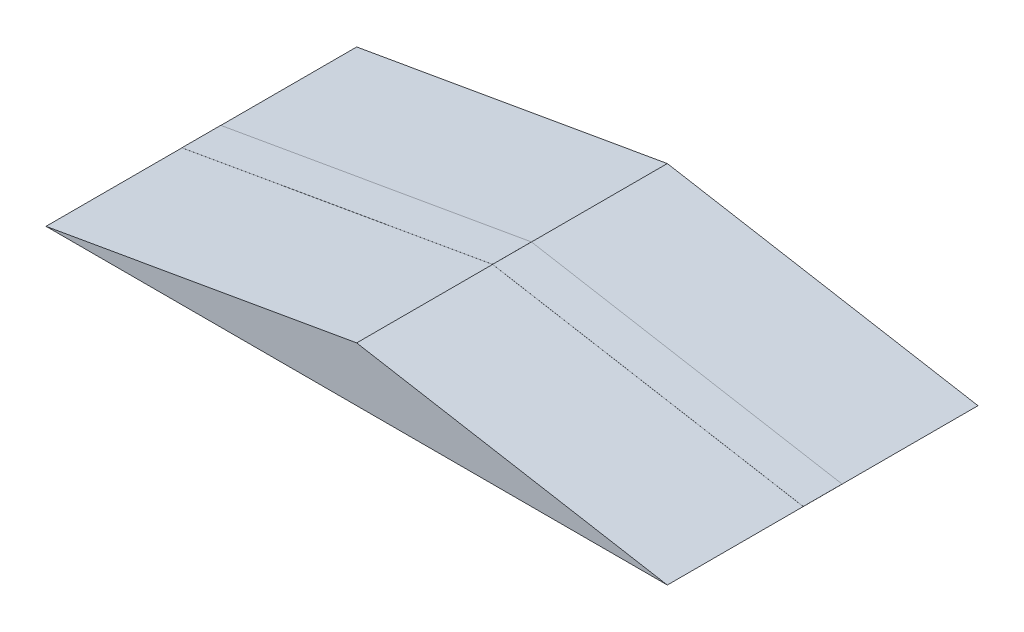
ISO-10303-21;
HEADER;
FILE_DESCRIPTION(('STEP AP214'),'2;1');
FILE_NAME('part.step','',(''),(''),'','','');
FILE_SCHEMA(('AUTOMOTIVE_DESIGN { 1 0 10303 214 1 1 1 1 }'));
ENDSEC;
DATA;
#1=APPLICATION_CONTEXT('core data for automotive mechanical design processes');
#2=APPLICATION_PROTOCOL_DEFINITION('international standard','automotive_design',2000,#1);
#3=PRODUCT_CONTEXT('',#1,'mechanical');
#4=PRODUCT('Part','Part','',(#3));
#5=PRODUCT_RELATED_PRODUCT_CATEGORY('part','',(#4));
#6=PRODUCT_DEFINITION_FORMATION('','',#4);
#7=PRODUCT_DEFINITION_CONTEXT('part definition',#1,'design');
#8=PRODUCT_DEFINITION('design','',#6,#7);
#9=PRODUCT_DEFINITION_SHAPE('','',#8);
#10=(LENGTH_UNIT() NAMED_UNIT(*) SI_UNIT(.MILLI.,.METRE.));
#11=(NAMED_UNIT(*) PLANE_ANGLE_UNIT() SI_UNIT($,.RADIAN.));
#12=(NAMED_UNIT(*) SI_UNIT($,.STERADIAN.) SOLID_ANGLE_UNIT());
#13=UNCERTAINTY_MEASURE_WITH_UNIT(LENGTH_MEASURE(1.E-05),#10,'distance_accuracy_value','');
#14=(GEOMETRIC_REPRESENTATION_CONTEXT(3) GLOBAL_UNCERTAINTY_ASSIGNED_CONTEXT((#13)) GLOBAL_UNIT_ASSIGNED_CONTEXT((#10,
#11,#12)) REPRESENTATION_CONTEXT('',''));
#15=CARTESIAN_POINT('',(0.,0.,0.));
#16=DIRECTION('',(0.,0.,1.));
#17=DIRECTION('',(1.,0.,0.));
#18=AXIS2_PLACEMENT_3D('',#15,#16,#17);
#19=CARTESIAN_POINT('',(-400.,0.,400.));
#20=DIRECTION('',(0.172380331752248,-0.985030467155704,0.));
#21=DIRECTION('',(0.985030467155704,0.172380331752248,0.));
#22=AXIS2_PLACEMENT_3D('',#19,#20,#21);
#23=PLANE('',#22);
#24=DIRECTION('',(0.,0.,-1.));
#25=VECTOR('',#24,1.);
#26=CARTESIAN_POINT('',(-400.,0.,400.));
#27=LINE('',#26,#25);
#28=CARTESIAN_POINT('',(-400.,0.,175.));
#29=VERTEX_POINT('',#28);
#30=CARTESIAN_POINT('',(-400.,0.,0.));
#31=VERTEX_POINT('',#30);
#32=EDGE_CURVE('E46',#29,#31,#27,.T.);
#33=ORIENTED_EDGE('',*,*,#32,.F.);
#34=DIRECTION('',(0.985030467155704,0.172380331752248,0.));
#35=VECTOR('',#34,1.);
#36=CARTESIAN_POINT('',(-400.,0.,175.));
#37=LINE('',#36,#35);
#38=CARTESIAN_POINT('',(0.,70.,175.));
#39=VERTEX_POINT('',#38);
#40=EDGE_CURVE('E148',#29,#39,#37,.T.);
#41=ORIENTED_EDGE('',*,*,#40,.T.);
#42=DIRECTION('',(0.,0.,-1.));
#43=VECTOR('',#42,1.);
#44=CARTESIAN_POINT('',(0.,70.,400.));
#45=LINE('',#44,#43);
#46=CARTESIAN_POINT('',(0.,70.,0.));
#47=VERTEX_POINT('',#46);
#48=EDGE_CURVE('E195',#39,#47,#45,.T.);
#49=ORIENTED_EDGE('',*,*,#48,.T.);
#50=DIRECTION('',(-0.985030467155704,-0.172380331752248,0.));
#51=VECTOR('',#50,1.);
#52=CARTESIAN_POINT('',(-400.,0.,0.));
#53=LINE('',#52,#51);
#54=EDGE_CURVE('E186',#47,#31,#53,.T.);
#55=ORIENTED_EDGE('',*,*,#54,.T.);
#56=EDGE_LOOP('',(#33,#41,#49,#55));
#57=FACE_BOUND('',#56,.T.);
#58=ADVANCED_FACE('F38',(#57),#23,.F.);
#59=CARTESIAN_POINT('',(400.,0.,400.));
#60=DIRECTION('',(-0.172380331752248,-0.985030467155704,0.));
#61=DIRECTION('',(0.985030467155704,-0.172380331752248,0.));
#62=AXIS2_PLACEMENT_3D('',#59,#60,#61);
#63=PLANE('',#62);
#64=DIRECTION('',(0.985030467155704,-0.172380331752248,0.));
#65=VECTOR('',#64,1.);
#66=CARTESIAN_POINT('',(400.,0.,225.));
#67=LINE('',#66,#65);
#68=CARTESIAN_POINT('',(0.,70.,225.));
#69=VERTEX_POINT('',#68);
#70=CARTESIAN_POINT('',(400.,0.,225.));
#71=VERTEX_POINT('',#70);
#72=EDGE_CURVE('E170',#69,#71,#67,.T.);
#73=ORIENTED_EDGE('',*,*,#72,.F.);
#74=CARTESIAN_POINT('',(0.,70.,400.));
#75=VERTEX_POINT('',#74);
#76=EDGE_CURVE('E203',#75,#69,#45,.T.);
#77=ORIENTED_EDGE('',*,*,#76,.F.);
#78=DIRECTION('',(-0.985030467155704,0.172380331752248,0.));
#79=VECTOR('',#78,1.);
#80=CARTESIAN_POINT('',(400.,0.,400.));
#81=LINE('',#80,#79);
#82=CARTESIAN_POINT('',(400.,0.,400.));
#83=VERTEX_POINT('',#82);
#84=EDGE_CURVE('E193',#83,#75,#81,.T.);
#85=ORIENTED_EDGE('',*,*,#84,.F.);
#86=DIRECTION('',(0.,0.,-1.));
#87=VECTOR('',#86,1.);
#88=CARTESIAN_POINT('',(400.,0.,400.));
#89=LINE('',#88,#87);
#90=EDGE_CURVE('E206',#83,#71,#89,.T.);
#91=ORIENTED_EDGE('',*,*,#90,.T.);
#92=EDGE_LOOP('',(#73,#77,#85,#91));
#93=FACE_BOUND('',#92,.T.);
#94=ADVANCED_FACE('F237',(#93),#63,.F.);
#95=DIRECTION('',(-0.985030467155704,0.172380331752248,0.));
#96=VECTOR('',#95,1.);
#97=CARTESIAN_POINT('',(400.,0.,175.));
#98=LINE('',#97,#96);
#99=CARTESIAN_POINT('',(400.,0.,175.));
#100=VERTEX_POINT('',#99);
#101=EDGE_CURVE('E53',#100,#39,#98,.T.);
#102=ORIENTED_EDGE('',*,*,#101,.F.);
#103=CARTESIAN_POINT('',(400.,0.,0.));
#104=VERTEX_POINT('',#103);
#105=EDGE_CURVE('E205',#100,#104,#89,.T.);
#106=ORIENTED_EDGE('',*,*,#105,.T.);
#107=DIRECTION('',(-0.985030467155704,0.172380331752248,0.));
#108=VECTOR('',#107,1.);
#109=CARTESIAN_POINT('',(400.,0.,0.));
#110=LINE('',#109,#108);
#111=EDGE_CURVE('E191',#104,#47,#110,.T.);
#112=ORIENTED_EDGE('',*,*,#111,.T.);
#113=ORIENTED_EDGE('',*,*,#48,.F.);
#114=EDGE_LOOP('',(#102,#106,#112,#113));
#115=FACE_BOUND('',#114,.T.);
#116=ADVANCED_FACE('F210',(#115),#63,.F.);
#117=ORIENTED_EDGE('',*,*,#76,.T.);
#118=DIRECTION('',(-0.985030467155704,-0.172380331752248,0.));
#119=VECTOR('',#118,1.);
#120=CARTESIAN_POINT('',(-400.,0.,225.));
#121=LINE('',#120,#119);
#122=CARTESIAN_POINT('',(-400.,0.,225.));
#123=VERTEX_POINT('',#122);
#124=EDGE_CURVE('E139',#69,#123,#121,.T.);
#125=ORIENTED_EDGE('',*,*,#124,.T.);
#126=CARTESIAN_POINT('',(-400.,0.,400.));
#127=VERTEX_POINT('',#126);
#128=EDGE_CURVE('E11',#127,#123,#27,.T.);
#129=ORIENTED_EDGE('',*,*,#128,.F.);
#130=DIRECTION('',(-0.985030467155704,-0.172380331752248,0.));
#131=VECTOR('',#130,1.);
#132=CARTESIAN_POINT('',(-400.,0.,400.));
#133=LINE('',#132,#131);
#134=EDGE_CURVE('E187',#75,#127,#133,.T.);
#135=ORIENTED_EDGE('',*,*,#134,.F.);
#136=EDGE_LOOP('',(#117,#125,#129,#135));
#137=FACE_BOUND('',#136,.T.);
#138=ADVANCED_FACE('F40',(#137),#23,.F.);
#139=CARTESIAN_POINT('',(-400.,0.,400.));
#140=DIRECTION('',(0.,1.,0.));
#141=DIRECTION('',(0.,0.,1.));
#142=AXIS2_PLACEMENT_3D('',#139,#140,#141);
#143=PLANE('',#142);
#144=DIRECTION('',(1.,0.,0.));
#145=VECTOR('',#144,1.);
#146=CARTESIAN_POINT('',(-400.,0.,0.));
#147=LINE('',#146,#145);
#148=EDGE_CURVE('E198',#31,#104,#147,.T.);
#149=ORIENTED_EDGE('',*,*,#148,.T.);
#150=ORIENTED_EDGE('',*,*,#105,.F.);
#151=DIRECTION('',(0.,0.,-1.));
#152=VECTOR('',#151,1.);
#153=CARTESIAN_POINT('',(400.,0.,225.));
#154=LINE('',#153,#152);
#155=EDGE_CURVE('E60',#71,#100,#154,.T.);
#156=ORIENTED_EDGE('',*,*,#155,.F.);
#157=ORIENTED_EDGE('',*,*,#90,.F.);
#158=DIRECTION('',(1.,0.,0.));
#159=VECTOR('',#158,1.);
#160=CARTESIAN_POINT('',(-400.,0.,400.));
#161=LINE('',#160,#159);
#162=EDGE_CURVE('E190',#127,#83,#161,.T.);
#163=ORIENTED_EDGE('',*,*,#162,.F.);
#164=ORIENTED_EDGE('',*,*,#128,.T.);
#165=DIRECTION('',(0.,0.,-1.));
#166=VECTOR('',#165,1.);
#167=CARTESIAN_POINT('',(-400.,0.,225.));
#168=LINE('',#167,#166);
#169=EDGE_CURVE('E150',#123,#29,#168,.T.);
#170=ORIENTED_EDGE('',*,*,#169,.T.);
#171=ORIENTED_EDGE('',*,*,#32,.T.);
#172=EDGE_LOOP('',(#149,#150,#156,#157,#163,#164,#170,#171));
#173=FACE_BOUND('',#172,.T.);
#174=ADVANCED_FACE('F214',(#173),#143,.F.);
#175=CARTESIAN_POINT('',(0.,0.,400.));
#176=DIRECTION('',(0.,0.,1.));
#177=DIRECTION('',(1.,0.,0.));
#178=AXIS2_PLACEMENT_3D('',#175,#176,#177);
#179=PLANE('',#178);
#180=ORIENTED_EDGE('',*,*,#134,.T.);
#181=ORIENTED_EDGE('',*,*,#162,.T.);
#182=ORIENTED_EDGE('',*,*,#84,.T.);
#183=EDGE_LOOP('',(#180,#181,#182));
#184=FACE_BOUND('',#183,.T.);
#185=ADVANCED_FACE('F242',(#184),#179,.T.);
#186=CARTESIAN_POINT('',(0.,0.,0.));
#187=DIRECTION('',(0.,0.,1.));
#188=DIRECTION('',(1.,0.,0.));
#189=AXIS2_PLACEMENT_3D('',#186,#187,#188);
#190=PLANE('',#189);
#191=ORIENTED_EDGE('',*,*,#54,.F.);
#192=ORIENTED_EDGE('',*,*,#111,.F.);
#193=ORIENTED_EDGE('',*,*,#148,.F.);
#194=EDGE_LOOP('',(#191,#192,#193));
#195=FACE_BOUND('',#194,.T.);
#196=ADVANCED_FACE('F217',(#195),#190,.F.);
#197=CARTESIAN_POINT('',(0.0172380331752422,70.0985030467156,225.));
#198=DIRECTION('',(0.985030467155704,-0.172380331752248,0.));
#199=DIRECTION('',(0.172380331752248,0.985030467155704,0.));
#200=AXIS2_PLACEMENT_3D('',#197,#198,#199);
#201=PLANE('',#200);
#202=DIRECTION('',(0.,0.,1.));
#203=VECTOR('',#202,1.);
#204=CARTESIAN_POINT('',(0.,70.,225.));
#205=LINE('',#204,#203);
#206=EDGE_CURVE('E124',#39,#69,#205,.T.);
#207=ORIENTED_EDGE('',*,*,#206,.T.);
#208=DIRECTION('',(-0.172380331752248,-0.985030467155704,0.));
#209=VECTOR('',#208,1.);
#210=CARTESIAN_POINT('',(0.0172380331752422,70.0985030467156,225.));
#211=LINE('',#210,#209);
#212=CARTESIAN_POINT('',(0.0172380331752422,70.0985030467156,225.));
#213=VERTEX_POINT('',#212);
#214=EDGE_CURVE('E183',#213,#69,#211,.T.);
#215=ORIENTED_EDGE('',*,*,#214,.F.);
#216=DIRECTION('',(0.,0.,1.));
#217=VECTOR('',#216,1.);
#218=CARTESIAN_POINT('',(0.0172380331752422,70.0985030467156,225.));
#219=LINE('',#218,#217);
#220=CARTESIAN_POINT('',(0.0172380331752422,70.0985030467156,175.));
#221=VERTEX_POINT('',#220);
#222=EDGE_CURVE('E159',#221,#213,#219,.T.);
#223=ORIENTED_EDGE('',*,*,#222,.F.);
#224=DIRECTION('',(-0.172380331752248,-0.985030467155704,0.));
#225=VECTOR('',#224,1.);
#226=CARTESIAN_POINT('',(0.0172380331752422,70.0985030467156,175.));
#227=LINE('',#226,#225);
#228=EDGE_CURVE('E168',#221,#39,#227,.T.);
#229=ORIENTED_EDGE('',*,*,#228,.T.);
#230=EDGE_LOOP('',(#207,#215,#223,#229));
#231=FACE_BOUND('',#230,.T.);
#232=ADVANCED_FACE('F226',(#231),#201,.F.);
#233=CARTESIAN_POINT('',(400.017238033175,0.0985030467155982,225.));
#234=DIRECTION('',(0.,0.,-1.));
#235=DIRECTION('',(-1.,0.,0.));
#236=AXIS2_PLACEMENT_3D('',#233,#234,#235);
#237=PLANE('',#236);
#238=ORIENTED_EDGE('',*,*,#72,.T.);
#239=DIRECTION('',(-0.172380331752248,-0.985030467155704,0.));
#240=VECTOR('',#239,1.);
#241=CARTESIAN_POINT('',(400.017238033175,0.0985030467155982,225.));
#242=LINE('',#241,#240);
#243=CARTESIAN_POINT('',(400.017238033175,0.0985030467155982,225.));
#244=VERTEX_POINT('',#243);
#245=EDGE_CURVE('E180',#244,#71,#242,.T.);
#246=ORIENTED_EDGE('',*,*,#245,.F.);
#247=DIRECTION('',(0.985030467155704,-0.172380331752248,0.));
#248=VECTOR('',#247,1.);
#249=CARTESIAN_POINT('',(400.017238033175,0.0985030467155982,225.));
#250=LINE('',#249,#248);
#251=EDGE_CURVE('E162',#213,#244,#250,.T.);
#252=ORIENTED_EDGE('',*,*,#251,.F.);
#253=ORIENTED_EDGE('',*,*,#214,.T.);
#254=EDGE_LOOP('',(#238,#246,#252,#253));
#255=FACE_BOUND('',#254,.T.);
#256=ADVANCED_FACE('F235',(#255),#237,.F.);
#257=CARTESIAN_POINT('',(400.017238033175,0.0985030467155982,225.));
#258=DIRECTION('',(-0.985030467155704,0.172380331752248,0.));
#259=DIRECTION('',(-0.172380331752248,-0.985030467155704,0.));
#260=AXIS2_PLACEMENT_3D('',#257,#258,#259);
#261=PLANE('',#260);
#262=ORIENTED_EDGE('',*,*,#155,.T.);
#263=DIRECTION('',(-0.172380331752248,-0.985030467155704,0.));
#264=VECTOR('',#263,1.);
#265=CARTESIAN_POINT('',(400.017238033175,0.0985030467155982,175.));
#266=LINE('',#265,#264);
#267=CARTESIAN_POINT('',(400.017238033175,0.0985030467155982,175.));
#268=VERTEX_POINT('',#267);
#269=EDGE_CURVE('E177',#268,#100,#266,.T.);
#270=ORIENTED_EDGE('',*,*,#269,.F.);
#271=DIRECTION('',(0.,0.,-1.));
#272=VECTOR('',#271,1.);
#273=CARTESIAN_POINT('',(400.017238033175,0.0985030467155982,225.));
#274=LINE('',#273,#272);
#275=EDGE_CURVE('E164',#244,#268,#274,.T.);
#276=ORIENTED_EDGE('',*,*,#275,.F.);
#277=ORIENTED_EDGE('',*,*,#245,.T.);
#278=EDGE_LOOP('',(#262,#270,#276,#277));
#279=FACE_BOUND('',#278,.T.);
#280=ADVANCED_FACE('F233',(#279),#261,.F.);
#281=CARTESIAN_POINT('',(400.017238033175,0.0985030467155982,175.));
#282=DIRECTION('',(0.,0.,1.));
#283=DIRECTION('',(1.,0.,0.));
#284=AXIS2_PLACEMENT_3D('',#281,#282,#283);
#285=PLANE('',#284);
#286=ORIENTED_EDGE('',*,*,#101,.T.);
#287=ORIENTED_EDGE('',*,*,#228,.F.);
#288=DIRECTION('',(-0.985030467155704,0.172380331752248,0.));
#289=VECTOR('',#288,1.);
#290=CARTESIAN_POINT('',(400.017238033175,0.0985030467155982,175.));
#291=LINE('',#290,#289);
#292=EDGE_CURVE('E166',#268,#221,#291,.T.);
#293=ORIENTED_EDGE('',*,*,#292,.F.);
#294=ORIENTED_EDGE('',*,*,#269,.T.);
#295=EDGE_LOOP('',(#286,#287,#293,#294));
#296=FACE_BOUND('',#295,.T.);
#297=ADVANCED_FACE('F221',(#296),#285,.F.);
#298=CARTESIAN_POINT('',(11.9032295431813,68.0184545324646,0.));
#299=DIRECTION('',(0.172380331752248,0.985030467155704,0.));
#300=DIRECTION('',(-0.985030467155704,0.172380331752248,0.));
#301=AXIS2_PLACEMENT_3D('',#298,#299,#300);
#302=PLANE('',#301);
#303=ORIENTED_EDGE('',*,*,#222,.T.);
#304=ORIENTED_EDGE('',*,*,#251,.T.);
#305=ORIENTED_EDGE('',*,*,#275,.T.);
#306=ORIENTED_EDGE('',*,*,#292,.T.);
#307=EDGE_LOOP('',(#303,#304,#305,#306));
#308=FACE_BOUND('',#307,.T.);
#309=ADVANCED_FACE('F229',(#308),#302,.T.);
#310=CARTESIAN_POINT('',(-0.0172380331752422,70.0985030467156,225.));
#311=DIRECTION('',(0.985030467155704,0.172380331752248,0.));
#312=DIRECTION('',(-0.172380331752248,0.985030467155704,0.));
#313=AXIS2_PLACEMENT_3D('',#310,#311,#312);
#314=PLANE('',#313);
#315=ORIENTED_EDGE('',*,*,#206,.F.);
#316=DIRECTION('',(0.172380331752248,-0.985030467155704,0.));
#317=VECTOR('',#316,1.);
#318=CARTESIAN_POINT('',(-0.0172380331752422,70.0985030467156,175.));
#319=LINE('',#318,#317);
#320=CARTESIAN_POINT('',(-0.0172380331752422,70.0985030467156,175.));
#321=VERTEX_POINT('',#320);
#322=EDGE_CURVE('E117',#321,#39,#319,.T.);
#323=ORIENTED_EDGE('',*,*,#322,.F.);
#324=DIRECTION('',(0.,0.,1.));
#325=VECTOR('',#324,1.);
#326=CARTESIAN_POINT('',(-0.0172380331752422,70.0985030467156,225.));
#327=LINE('',#326,#325);
#328=CARTESIAN_POINT('',(-0.0172380331752422,70.0985030467156,225.));
#329=VERTEX_POINT('',#328);
#330=EDGE_CURVE('E121',#321,#329,#327,.T.);
#331=ORIENTED_EDGE('',*,*,#330,.T.);
#332=DIRECTION('',(0.172380331752248,-0.985030467155704,0.));
#333=VECTOR('',#332,1.);
#334=CARTESIAN_POINT('',(-0.0172380331752422,70.0985030467156,225.));
#335=LINE('',#334,#333);
#336=EDGE_CURVE('E147',#329,#69,#335,.T.);
#337=ORIENTED_EDGE('',*,*,#336,.T.);
#338=EDGE_LOOP('',(#315,#323,#331,#337));
#339=FACE_BOUND('',#338,.T.);
#340=ADVANCED_FACE('F119',(#339),#314,.T.);
#341=CARTESIAN_POINT('',(-400.017238033175,0.0985030467155982,175.));
#342=DIRECTION('',(0.,0.,-1.));
#343=DIRECTION('',(-1.,0.,0.));
#344=AXIS2_PLACEMENT_3D('',#341,#342,#343);
#345=PLANE('',#344);
#346=ORIENTED_EDGE('',*,*,#40,.F.);
#347=DIRECTION('',(0.172380331752248,-0.985030467155704,0.));
#348=VECTOR('',#347,1.);
#349=CARTESIAN_POINT('',(-400.017238033175,0.0985030467155982,175.));
#350=LINE('',#349,#348);
#351=CARTESIAN_POINT('',(-400.017238033175,0.0985030467155982,175.));
#352=VERTEX_POINT('',#351);
#353=EDGE_CURVE('E129',#352,#29,#350,.T.);
#354=ORIENTED_EDGE('',*,*,#353,.F.);
#355=DIRECTION('',(0.985030467155704,0.172380331752248,0.));
#356=VECTOR('',#355,1.);
#357=CARTESIAN_POINT('',(-400.017238033175,0.0985030467155982,175.));
#358=LINE('',#357,#356);
#359=EDGE_CURVE('E135',#352,#321,#358,.T.);
#360=ORIENTED_EDGE('',*,*,#359,.T.);
#361=ORIENTED_EDGE('',*,*,#322,.T.);
#362=EDGE_LOOP('',(#346,#354,#360,#361));
#363=FACE_BOUND('',#362,.T.);
#364=ADVANCED_FACE('F141',(#363),#345,.T.);
#365=CARTESIAN_POINT('',(-400.017238033175,0.0985030467155982,225.));
#366=DIRECTION('',(-0.985030467155704,-0.172380331752248,0.));
#367=DIRECTION('',(0.172380331752248,-0.985030467155704,0.));
#368=AXIS2_PLACEMENT_3D('',#365,#366,#367);
#369=PLANE('',#368);
#370=ORIENTED_EDGE('',*,*,#169,.F.);
#371=DIRECTION('',(0.172380331752248,-0.985030467155704,0.));
#372=VECTOR('',#371,1.);
#373=CARTESIAN_POINT('',(-400.017238033175,0.0985030467155982,225.));
#374=LINE('',#373,#372);
#375=CARTESIAN_POINT('',(-400.017238033175,0.0985030467155982,225.));
#376=VERTEX_POINT('',#375);
#377=EDGE_CURVE('E156',#376,#123,#374,.T.);
#378=ORIENTED_EDGE('',*,*,#377,.F.);
#379=DIRECTION('',(0.,0.,-1.));
#380=VECTOR('',#379,1.);
#381=CARTESIAN_POINT('',(-400.017238033175,0.0985030467155982,225.));
#382=LINE('',#381,#380);
#383=EDGE_CURVE('E142',#376,#352,#382,.T.);
#384=ORIENTED_EDGE('',*,*,#383,.T.);
#385=ORIENTED_EDGE('',*,*,#353,.T.);
#386=EDGE_LOOP('',(#370,#378,#384,#385));
#387=FACE_BOUND('',#386,.T.);
#388=ADVANCED_FACE('F245',(#387),#369,.T.);
#389=CARTESIAN_POINT('',(-400.017238033175,0.0985030467155982,225.));
#390=DIRECTION('',(0.,0.,1.));
#391=DIRECTION('',(1.,0.,0.));
#392=AXIS2_PLACEMENT_3D('',#389,#390,#391);
#393=PLANE('',#392);
#394=ORIENTED_EDGE('',*,*,#124,.F.);
#395=ORIENTED_EDGE('',*,*,#336,.F.);
#396=DIRECTION('',(-0.985030467155704,-0.172380331752248,0.));
#397=VECTOR('',#396,1.);
#398=CARTESIAN_POINT('',(-400.017238033175,0.0985030467155982,225.));
#399=LINE('',#398,#397);
#400=EDGE_CURVE('E138',#329,#376,#399,.T.);
#401=ORIENTED_EDGE('',*,*,#400,.T.);
#402=ORIENTED_EDGE('',*,*,#377,.T.);
#403=EDGE_LOOP('',(#394,#395,#401,#402));
#404=FACE_BOUND('',#403,.T.);
#405=ADVANCED_FACE('F247',(#404),#393,.T.);
#406=CARTESIAN_POINT('',(-11.9032295431813,68.0184545324646,0.));
#407=DIRECTION('',(-0.172380331752248,0.985030467155704,0.));
#408=DIRECTION('',(0.985030467155704,0.172380331752248,0.));
#409=AXIS2_PLACEMENT_3D('',#406,#407,#408);
#410=PLANE('',#409);
#411=ORIENTED_EDGE('',*,*,#330,.F.);
#412=ORIENTED_EDGE('',*,*,#359,.F.);
#413=ORIENTED_EDGE('',*,*,#383,.F.);
#414=ORIENTED_EDGE('',*,*,#400,.F.);
#415=EDGE_LOOP('',(#411,#412,#413,#414));
#416=FACE_BOUND('',#415,.T.);
#417=ADVANCED_FACE('F133',(#416),#410,.T.);
#418=CLOSED_SHELL('',(#58,#94,#116,#138,#174,#185,#196,#232,#256,#280,#297,#309,#340,#364,#388,
#405,#417));
#419=MANIFOLD_SOLID_BREP('B2',#418);
#420=ADVANCED_BREP_SHAPE_REPRESENTATION('',(#18,#419),#14);
#421=SHAPE_DEFINITION_REPRESENTATION(#9,#420);
ENDSEC;
END-ISO-10303-21;
